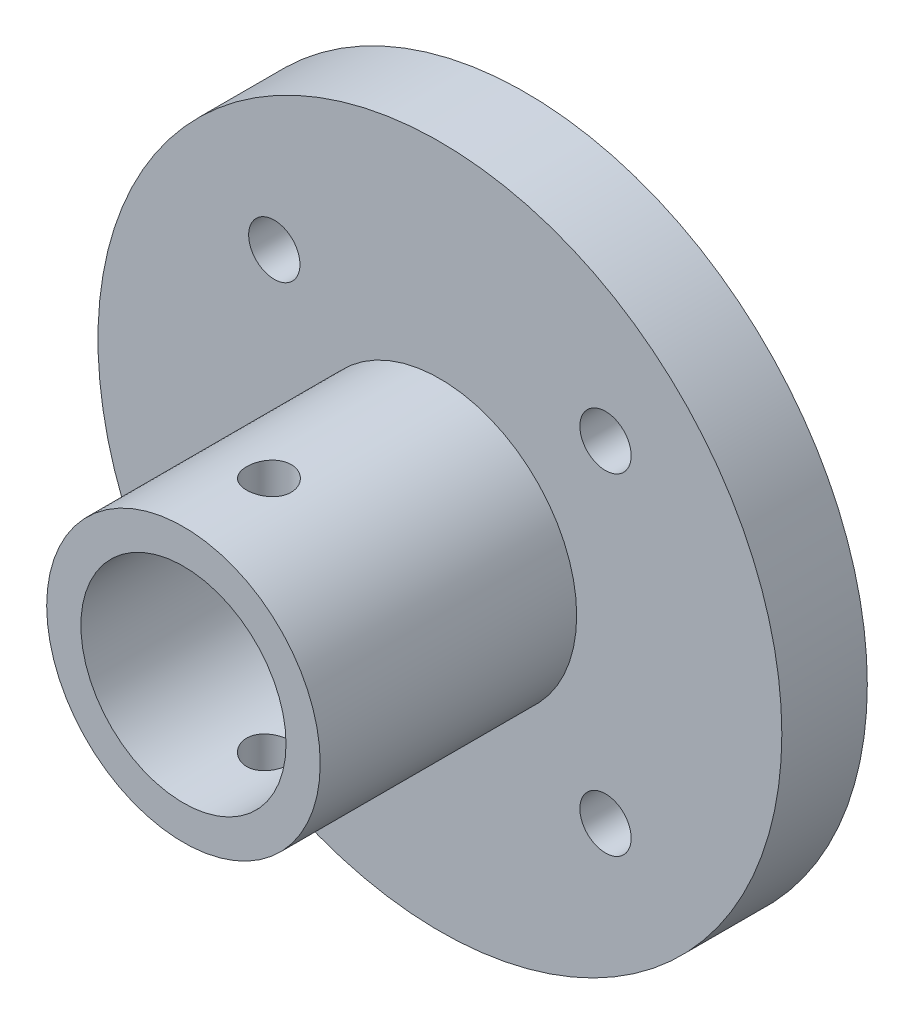
ISO-10303-21;
HEADER;
FILE_DESCRIPTION(('STEP AP214'),'2;1');
FILE_NAME('part.step','',(''),(''),'','','');
FILE_SCHEMA(('AUTOMOTIVE_DESIGN { 1 0 10303 214 1 1 1 1 }'));
ENDSEC;
DATA;
#1=APPLICATION_CONTEXT('core data for automotive mechanical design processes');
#2=APPLICATION_PROTOCOL_DEFINITION('international standard','automotive_design',2000,#1);
#3=PRODUCT_CONTEXT('',#1,'mechanical');
#4=PRODUCT('Part','Part','',(#3));
#5=PRODUCT_RELATED_PRODUCT_CATEGORY('part','',(#4));
#6=PRODUCT_DEFINITION_FORMATION('','',#4);
#7=PRODUCT_DEFINITION_CONTEXT('part definition',#1,'design');
#8=PRODUCT_DEFINITION('design','',#6,#7);
#9=PRODUCT_DEFINITION_SHAPE('','',#8);
#10=(LENGTH_UNIT() NAMED_UNIT(*) SI_UNIT(.MILLI.,.METRE.));
#11=(NAMED_UNIT(*) PLANE_ANGLE_UNIT() SI_UNIT($,.RADIAN.));
#12=(NAMED_UNIT(*) SI_UNIT($,.STERADIAN.) SOLID_ANGLE_UNIT());
#13=UNCERTAINTY_MEASURE_WITH_UNIT(LENGTH_MEASURE(1.E-05),#10,'distance_accuracy_value','');
#14=(GEOMETRIC_REPRESENTATION_CONTEXT(3) GLOBAL_UNCERTAINTY_ASSIGNED_CONTEXT((#13)) GLOBAL_UNIT_ASSIGNED_CONTEXT((#10,
#11,#12)) REPRESENTATION_CONTEXT('',''));
#15=CARTESIAN_POINT('',(0.,0.,0.));
#16=DIRECTION('',(0.,0.,1.));
#17=DIRECTION('',(1.,0.,0.));
#18=AXIS2_PLACEMENT_3D('',#15,#16,#17);
#19=CARTESIAN_POINT('',(0.,0.,5.));
#20=DIRECTION('',(0.,0.,1.));
#21=DIRECTION('',(1.,0.,0.));
#22=AXIS2_PLACEMENT_3D('',#19,#20,#21);
#23=PLANE('',#22);
#24=CARTESIAN_POINT('',(-9.68620346185681,-9.68620346185671,5.));
#25=DIRECTION('',(0.,0.,1.));
#26=DIRECTION('',(-1.,0.,0.));
#27=AXIS2_PLACEMENT_3D('',#24,#25,#26);
#28=CIRCLE('',#27,1.5);
#29=CARTESIAN_POINT('',(-11.1862034618568,-9.68620346185671,5.));
#30=VERTEX_POINT('',#29);
#31=EDGE_CURVE('E119',#30,#30,#28,.T.);
#32=ORIENTED_EDGE('',*,*,#31,.F.);
#33=EDGE_LOOP('',(#32));
#34=FACE_BOUND('',#33,.T.);
#35=CARTESIAN_POINT('',(9.68620346185681,9.68620346185671,5.));
#36=DIRECTION('',(0.,0.,1.));
#37=DIRECTION('',(-1.,0.,0.));
#38=AXIS2_PLACEMENT_3D('',#35,#36,#37);
#39=CIRCLE('',#38,1.5);
#40=CARTESIAN_POINT('',(8.18620346185681,9.68620346185671,5.));
#41=VERTEX_POINT('',#40);
#42=EDGE_CURVE('E133',#41,#41,#39,.T.);
#43=ORIENTED_EDGE('',*,*,#42,.F.);
#44=EDGE_LOOP('',(#43));
#45=FACE_BOUND('',#44,.T.);
#46=CARTESIAN_POINT('',(0.,0.,5.));
#47=DIRECTION('',(0.,0.,1.));
#48=DIRECTION('',(1.,0.,0.));
#49=AXIS2_PLACEMENT_3D('',#46,#47,#48);
#50=CIRCLE('',#49,20.);
#51=CARTESIAN_POINT('',(20.,0.,5.));
#52=VERTEX_POINT('',#51);
#53=EDGE_CURVE('E10',#52,#52,#50,.T.);
#54=ORIENTED_EDGE('',*,*,#53,.T.);
#55=EDGE_LOOP('',(#54));
#56=FACE_BOUND('',#55,.T.);
#57=CARTESIAN_POINT('',(-9.68620346185681,9.68620346185671,5.));
#58=DIRECTION('',(0.,0.,1.));
#59=DIRECTION('',(1.,0.,0.));
#60=AXIS2_PLACEMENT_3D('',#57,#58,#59);
#61=CIRCLE('',#60,1.5);
#62=CARTESIAN_POINT('',(-8.18620346185681,9.68620346185671,5.));
#63=VERTEX_POINT('',#62);
#64=EDGE_CURVE('E137',#63,#63,#61,.T.);
#65=ORIENTED_EDGE('',*,*,#64,.F.);
#66=EDGE_LOOP('',(#65));
#67=FACE_BOUND('',#66,.T.);
#68=CARTESIAN_POINT('',(9.68620346185681,-9.68620346185671,5.));
#69=DIRECTION('',(0.,0.,1.));
#70=DIRECTION('',(1.,0.,0.));
#71=AXIS2_PLACEMENT_3D('',#68,#69,#70);
#72=CIRCLE('',#71,1.5);
#73=CARTESIAN_POINT('',(11.1862034618568,-9.68620346185671,5.));
#74=VERTEX_POINT('',#73);
#75=EDGE_CURVE('E129',#74,#74,#72,.T.);
#76=ORIENTED_EDGE('',*,*,#75,.F.);
#77=EDGE_LOOP('',(#76));
#78=FACE_BOUND('',#77,.T.);
#79=CARTESIAN_POINT('',(0.,0.,5.));
#80=DIRECTION('',(0.,0.,1.));
#81=DIRECTION('',(1.,0.,0.));
#82=AXIS2_PLACEMENT_3D('',#79,#80,#81);
#83=CIRCLE('',#82,8.);
#84=CARTESIAN_POINT('',(8.,0.,5.));
#85=VERTEX_POINT('',#84);
#86=EDGE_CURVE('E125',#85,#85,#83,.T.);
#87=ORIENTED_EDGE('',*,*,#86,.F.);
#88=EDGE_LOOP('',(#87));
#89=FACE_BOUND('',#88,.T.);
#90=ADVANCED_FACE('F31',(#34,#45,#56,#67,#78,#89),#23,.T.);
#91=CARTESIAN_POINT('',(0.,0.,0.));
#92=DIRECTION('',(0.,0.,1.));
#93=DIRECTION('',(1.,0.,0.));
#94=AXIS2_PLACEMENT_3D('',#91,#92,#93);
#95=PLANE('',#94);
#96=CARTESIAN_POINT('',(0.,0.,0.));
#97=DIRECTION('',(0.,0.,1.));
#98=DIRECTION('',(1.,0.,0.));
#99=AXIS2_PLACEMENT_3D('',#96,#97,#98);
#100=CIRCLE('',#99,20.);
#101=CARTESIAN_POINT('',(20.,0.,0.));
#102=VERTEX_POINT('',#101);
#103=EDGE_CURVE('E43',#102,#102,#100,.T.);
#104=ORIENTED_EDGE('',*,*,#103,.F.);
#105=EDGE_LOOP('',(#104));
#106=FACE_BOUND('',#105,.T.);
#107=CARTESIAN_POINT('',(0.,0.,0.));
#108=DIRECTION('',(0.,0.,1.));
#109=DIRECTION('',(1.,0.,0.));
#110=AXIS2_PLACEMENT_3D('',#107,#108,#109);
#111=CIRCLE('',#110,6.);
#112=CARTESIAN_POINT('',(6.,0.,0.));
#113=VERTEX_POINT('',#112);
#114=EDGE_CURVE('E48',#113,#113,#111,.T.);
#115=ORIENTED_EDGE('',*,*,#114,.T.);
#116=EDGE_LOOP('',(#115));
#117=FACE_BOUND('',#116,.T.);
#118=CARTESIAN_POINT('',(-9.68620346185681,9.68620346185671,0.));
#119=DIRECTION('',(0.,0.,1.));
#120=DIRECTION('',(1.,0.,0.));
#121=AXIS2_PLACEMENT_3D('',#118,#119,#120);
#122=CIRCLE('',#121,1.5);
#123=CARTESIAN_POINT('',(-8.18620346185681,9.68620346185671,0.));
#124=VERTEX_POINT('',#123);
#125=EDGE_CURVE('E106',#124,#124,#122,.T.);
#126=ORIENTED_EDGE('',*,*,#125,.T.);
#127=EDGE_LOOP('',(#126));
#128=FACE_BOUND('',#127,.T.);
#129=CARTESIAN_POINT('',(9.68620346185681,9.68620346185671,0.));
#130=DIRECTION('',(0.,0.,1.));
#131=DIRECTION('',(-1.,0.,0.));
#132=AXIS2_PLACEMENT_3D('',#129,#130,#131);
#133=CIRCLE('',#132,1.5);
#134=CARTESIAN_POINT('',(8.18620346185681,9.68620346185671,0.));
#135=VERTEX_POINT('',#134);
#136=EDGE_CURVE('E110',#135,#135,#133,.T.);
#137=ORIENTED_EDGE('',*,*,#136,.T.);
#138=EDGE_LOOP('',(#137));
#139=FACE_BOUND('',#138,.T.);
#140=CARTESIAN_POINT('',(9.68620346185681,-9.68620346185671,0.));
#141=DIRECTION('',(0.,0.,1.));
#142=DIRECTION('',(1.,0.,0.));
#143=AXIS2_PLACEMENT_3D('',#140,#141,#142);
#144=CIRCLE('',#143,1.5);
#145=CARTESIAN_POINT('',(11.1862034618568,-9.68620346185671,0.));
#146=VERTEX_POINT('',#145);
#147=EDGE_CURVE('E114',#146,#146,#144,.T.);
#148=ORIENTED_EDGE('',*,*,#147,.T.);
#149=EDGE_LOOP('',(#148));
#150=FACE_BOUND('',#149,.T.);
#151=CARTESIAN_POINT('',(-9.68620346185681,-9.68620346185671,0.));
#152=DIRECTION('',(0.,0.,1.));
#153=DIRECTION('',(-1.,0.,0.));
#154=AXIS2_PLACEMENT_3D('',#151,#152,#153);
#155=CIRCLE('',#154,1.5);
#156=CARTESIAN_POINT('',(-11.1862034618568,-9.68620346185671,0.));
#157=VERTEX_POINT('',#156);
#158=EDGE_CURVE('E117',#157,#157,#155,.T.);
#159=ORIENTED_EDGE('',*,*,#158,.T.);
#160=EDGE_LOOP('',(#159));
#161=FACE_BOUND('',#160,.T.);
#162=ADVANCED_FACE('F90',(#106,#117,#128,#139,#150,#161),#95,.F.);
#163=CARTESIAN_POINT('',(0.,0.,5.));
#164=DIRECTION('',(0.,0.,-1.));
#165=DIRECTION('',(-1.,0.,0.));
#166=AXIS2_PLACEMENT_3D('',#163,#164,#165);
#167=CYLINDRICAL_SURFACE('',#166,20.);
#168=ORIENTED_EDGE('',*,*,#53,.F.);
#169=EDGE_LOOP('',(#168));
#170=FACE_BOUND('',#169,.T.);
#171=ORIENTED_EDGE('',*,*,#103,.T.);
#172=EDGE_LOOP('',(#171));
#173=FACE_BOUND('',#172,.T.);
#174=ADVANCED_FACE('F33',(#170,#173),#167,.T.);
#175=CARTESIAN_POINT('',(0.,0.,5.));
#176=DIRECTION('',(0.,0.,-1.));
#177=DIRECTION('',(-1.,0.,0.));
#178=AXIS2_PLACEMENT_3D('',#175,#176,#177);
#179=CYLINDRICAL_SURFACE('',#178,6.);
#180=CARTESIAN_POINT('',(0.,-6.,16.301925597688));
#181=CARTESIAN_POINT('',(0.0722225522556389,-5.9999986660787,16.3019231115351));
#182=CARTESIAN_POINT('',(0.14447527714328,-5.99868271184309,16.2958956351828));
#183=CARTESIAN_POINT('',(0.286929376806367,-5.99356019935167,16.2719694471695));
#184=CARTESIAN_POINT('',(0.357129231674901,-5.98975184221741,16.2540621611918));
#185=CARTESIAN_POINT('',(0.493398156167817,-5.9800686728557,16.2069628726351));
#186=CARTESIAN_POINT('',(0.559471424271425,-5.97419600261258,16.1777825641377));
#187=CARTESIAN_POINT('',(0.685781720002537,-5.96101847415905,16.1090024398041));
#188=CARTESIAN_POINT('',(0.746018917328764,-5.95371365761065,16.0694029270575));
#189=CARTESIAN_POINT('',(0.859901836073007,-5.93834332663798,15.9802459714752));
#190=CARTESIAN_POINT('',(0.913442096869974,-5.93026850222319,15.9305554137689));
#191=CARTESIAN_POINT('',(1.01149701474847,-5.91433404154723,15.8229127109291));
#192=CARTESIAN_POINT('',(1.05601087717529,-5.90647442428485,15.7649598391726));
#193=CARTESIAN_POINT('',(1.13521313338209,-5.89176856565059,15.6416598624638));
#194=CARTESIAN_POINT('',(1.16978955194762,-5.88493425876969,15.5762392793223));
#195=CARTESIAN_POINT('',(1.22741724526148,-5.87318632142876,15.4403435355366));
#196=CARTESIAN_POINT('',(1.25046987462628,-5.86827246523539,15.3698689700999));
#197=CARTESIAN_POINT('',(1.28404766607214,-5.86101655052557,15.2270088826443));
#198=CARTESIAN_POINT('',(1.29475938755671,-5.85863623530326,15.1546691939416));
#199=CARTESIAN_POINT('',(1.3039313203686,-5.85660198785184,15.0091833388932));
#200=CARTESIAN_POINT('',(1.30239301292097,-5.85694772599908,14.9360372711196));
#201=CARTESIAN_POINT('',(1.28725875480789,-5.86029187434003,14.7923997989849));
#202=CARTESIAN_POINT('',(1.27387924989609,-5.86324266429241,14.7218843125273));
#203=CARTESIAN_POINT('',(1.23578518581303,-5.87138917610019,14.584123275485));
#204=CARTESIAN_POINT('',(1.21106999974528,-5.87658502211286,14.5168779059749));
#205=CARTESIAN_POINT('',(1.15080664156936,-5.88868330086407,14.3869560018725));
#206=CARTESIAN_POINT('',(1.11517499653382,-5.89559880343725,14.3243194533073));
#207=CARTESIAN_POINT('',(1.03414888483502,-5.91034914046138,14.2058343298974));
#208=CARTESIAN_POINT('',(0.988753107351076,-5.91818409828363,14.1499866680281));
#209=CARTESIAN_POINT('',(0.888340334120309,-5.93409505416124,14.0454182102309));
#210=CARTESIAN_POINT('',(0.833139220797979,-5.9421726343636,13.9968742836473));
#211=CARTESIAN_POINT('',(0.715288483982947,-5.95750684216897,13.9097044279518));
#212=CARTESIAN_POINT('',(0.652638729709158,-5.96476345535331,13.871078673018));
#213=CARTESIAN_POINT('',(0.521455094954468,-5.97766107598465,13.8047989641655));
#214=CARTESIAN_POINT('',(0.452909295895972,-5.98329870601971,13.777167901007));
#215=CARTESIAN_POINT('',(0.31199820714713,-5.99229800205441,13.7338649316782));
#216=CARTESIAN_POINT('',(0.239633465466107,-5.99565999365071,13.7181913146045));
#217=CARTESIAN_POINT('',(0.0946560602199999,-5.99968295940403,13.6995047479866));
#218=CARTESIAN_POINT('',(0.0220759327056072,-6.00039547952921,13.6962501508006));
#219=CARTESIAN_POINT('',(-0.1225909353168,-5.99918354368445,13.7018394391357));
#220=CARTESIAN_POINT('',(-0.194677708409383,-5.99725926358977,13.7106825177386));
#221=CARTESIAN_POINT('',(-0.335512966169066,-5.99102244564979,13.7400157196482));
#222=CARTESIAN_POINT('',(-0.404289044979731,-5.98673585571554,13.760379363094));
#223=CARTESIAN_POINT('',(-0.53744939872132,-5.97625410103079,13.8120354681597));
#224=CARTESIAN_POINT('',(-0.601833303055578,-5.97005877547038,13.8433288506337));
#225=CARTESIAN_POINT('',(-0.725382820064091,-5.95631947784206,13.9164614664587));
#226=CARTESIAN_POINT('',(-0.784462182404095,-5.94875774287641,13.9584429993347));
#227=CARTESIAN_POINT('',(-0.894824228343959,-5.93316117425841,14.0515725287005));
#228=CARTESIAN_POINT('',(-0.946105914957435,-5.92512628029132,14.1027216955168));
#229=CARTESIAN_POINT('',(-1.04037010489555,-5.90931134685607,14.2138426074747));
#230=CARTESIAN_POINT('',(-1.08318541164402,-5.90153856229194,14.2739574084959));
#231=CARTESIAN_POINT('',(-1.15811310621895,-5.88729432979624,14.4006664178984));
#232=CARTESIAN_POINT('',(-1.19022595456335,-5.88082282587639,14.4672603473287));
#233=CARTESIAN_POINT('',(-1.24262207909274,-5.86997503693497,14.6046816389176));
#234=CARTESIAN_POINT('',(-1.26297145943996,-5.86558706898549,14.675482829229));
#235=CARTESIAN_POINT('',(-1.2914573808728,-5.8593817291553,14.819606933179));
#236=CARTESIAN_POINT('',(-1.29959583938032,-5.85756395369232,14.892929449056));
#237=CARTESIAN_POINT('',(-1.30334830095698,-5.85672995796827,15.0383297631023));
#238=CARTESIAN_POINT('',(-1.2992273098345,-5.85765445817055,15.1104005088571));
#239=CARTESIAN_POINT('',(-1.27916956445401,-5.86206693668976,15.2527944888059));
#240=CARTESIAN_POINT('',(-1.26323294488804,-5.86555488578469,15.323117742911));
#241=CARTESIAN_POINT('',(-1.2201234347199,-5.87467258765381,15.4598140487272));
#242=CARTESIAN_POINT('',(-1.19298852822042,-5.88029509498607,15.5261995946205));
#243=CARTESIAN_POINT('',(-1.12828555394478,-5.89305135537327,15.6535154910708));
#244=CARTESIAN_POINT('',(-1.09071641911818,-5.900185262973,15.714445282855));
#245=CARTESIAN_POINT('',(-1.00532994372966,-5.91533800804554,15.8304277547537));
#246=CARTESIAN_POINT('',(-0.957323496061684,-5.92337163365257,15.8853393083185));
#247=CARTESIAN_POINT('',(-0.852809065100796,-5.93931862229132,15.986414190123));
#248=CARTESIAN_POINT('',(-0.796299120778838,-5.94723195711757,16.0325754948658));
#249=CARTESIAN_POINT('',(-0.675515575803022,-5.96216609607497,16.1154010912594));
#250=CARTESIAN_POINT('',(-0.611152345919765,-5.96917426361034,16.1519370804659));
#251=CARTESIAN_POINT('',(-0.477060403678897,-5.98138191769254,16.213614456066));
#252=CARTESIAN_POINT('',(-0.40733628225979,-5.98658293123012,16.2387654678911));
#253=CARTESIAN_POINT('',(-0.281278210685381,-5.99365428599087,16.2724388415615));
#254=CARTESIAN_POINT('',(-0.225629859183479,-5.99601926835914,16.2834754124416));
#255=CARTESIAN_POINT('',(-0.113327169155402,-5.99919261526455,16.2982196083981));
#256=CARTESIAN_POINT('',(-0.0566728739851214,-6.00000104672504,16.3019275485666));
#257=CARTESIAN_POINT('',(0.,-6.,16.301925597688));
#258=B_SPLINE_CURVE_WITH_KNOTS('',3,(#180,#181,#182,#183,#184,#185,#186,#187,#188,#189,#190,
#191,#192,#193,#194,#195,#196,#197,#198,#199,#200,#201,#202,#203,#204,#205,#206,#207,#208,#209,
#210,#211,#212,#213,#214,#215,#216,#217,#218,#219,#220,#221,#222,#223,#224,#225,#226,#227,#228,
#229,#230,#231,#232,#233,#234,#235,#236,#237,#238,#239,#240,#241,#242,#243,#244,#245,#246,#247,
#248,#249,#250,#251,#252,#253,#254,#255,#256,#257),.UNSPECIFIED.,.T.,.F.,(4,2,2,2,2,2,2,2,2,2,2,
2,2,2,2,2,2,2,2,2,2,2,2,2,2,2,2,2,2,2,2,2,2,2,2,2,2,2,4),(0.,0.216460222852282,
0.433076847260712,0.649469364971901,0.865855588626085,1.08530707799076,1.30477787876966,
1.52663255294226,1.74846114205698,1.96689039556855,2.18529323787967,2.39978448666122,
2.61428759886981,2.83047367741662,3.04668879676693,3.26750314624514,3.48832137329063,
3.70959696433462,3.9308408887342,4.14775725239463,4.36465914838107,4.57922472775948,
4.79380838911249,5.01141378241322,5.22904697470536,5.45062320549926,5.67218990081975,
5.8924990978004,6.11277369707351,6.32832158316371,6.5438670121575,6.75868725245523,
6.97352946931691,7.19264816471728,7.41181746971381,7.63377525752516,7.85554503897787,
8.02540819137698,8.19526404040704),.UNSPECIFIED.);
#259=CARTESIAN_POINT('',(0.,-6.,16.301925597688));
#260=VERTEX_POINT('',#259);
#261=EDGE_CURVE('E76',#260,#260,#258,.T.);
#262=ORIENTED_EDGE('',*,*,#261,.F.);
#263=EDGE_LOOP('',(#262));
#264=FACE_BOUND('',#263,.T.);
#265=CARTESIAN_POINT('',(0.,6.,16.301925597688));
#266=CARTESIAN_POINT('',(-0.0722225522556355,5.9999986660787,16.3019231115351));
#267=CARTESIAN_POINT('',(-0.144475277143277,5.99868271184309,16.2958956351828));
#268=CARTESIAN_POINT('',(-0.286929376806364,5.99356019935167,16.2719694471695));
#269=CARTESIAN_POINT('',(-0.357129231674897,5.98975184221741,16.2540621611918));
#270=CARTESIAN_POINT('',(-0.493398156167814,5.9800686728557,16.2069628726351));
#271=CARTESIAN_POINT('',(-0.559471424271424,5.97419600261258,16.1777825641377));
#272=CARTESIAN_POINT('',(-0.685781720002535,5.96101847415906,16.1090024398041));
#273=CARTESIAN_POINT('',(-0.746018917328761,5.95371365761065,16.0694029270575));
#274=CARTESIAN_POINT('',(-0.859901836073004,5.93834332663798,15.9802459714752));
#275=CARTESIAN_POINT('',(-0.91344209686997,5.93026850222319,15.9305554137689));
#276=CARTESIAN_POINT('',(-1.01149701474846,5.91433404154723,15.8229127109291));
#277=CARTESIAN_POINT('',(-1.05601087717529,5.90647442428485,15.7649598391726));
#278=CARTESIAN_POINT('',(-1.13521313338208,5.89176856565059,15.6416598624638));
#279=CARTESIAN_POINT('',(-1.16978955194762,5.88493425876969,15.5762392793223));
#280=CARTESIAN_POINT('',(-1.22741724526148,5.87318632142876,15.4403435355366));
#281=CARTESIAN_POINT('',(-1.25046987462628,5.86827246523539,15.3698689700999));
#282=CARTESIAN_POINT('',(-1.28404766607214,5.86101655052557,15.2270088826443));
#283=CARTESIAN_POINT('',(-1.29475938755671,5.85863623530327,15.1546691939416));
#284=CARTESIAN_POINT('',(-1.3039313203686,5.85660198785184,15.0091833388932));
#285=CARTESIAN_POINT('',(-1.30239301292097,5.85694772599908,14.9360372711196));
#286=CARTESIAN_POINT('',(-1.28725875480788,5.86029187434003,14.7923997989849));
#287=CARTESIAN_POINT('',(-1.27387924989609,5.86324266429241,14.7218843125273));
#288=CARTESIAN_POINT('',(-1.23578518581303,5.87138917610019,14.584123275485));
#289=CARTESIAN_POINT('',(-1.21106999974528,5.87658502211286,14.5168779059749));
#290=CARTESIAN_POINT('',(-1.15080664156936,5.88868330086407,14.3869560018725));
#291=CARTESIAN_POINT('',(-1.11517499653382,5.89559880343725,14.3243194533073));
#292=CARTESIAN_POINT('',(-1.03414888483501,5.91034914046138,14.2058343298974));
#293=CARTESIAN_POINT('',(-0.988753107351073,5.91818409828363,14.1499866680281));
#294=CARTESIAN_POINT('',(-0.888340334120305,5.93409505416124,14.0454182102309));
#295=CARTESIAN_POINT('',(-0.833139220797976,5.9421726343636,13.9968742836473));
#296=CARTESIAN_POINT('',(-0.715288483982944,5.95750684216897,13.9097044279518));
#297=CARTESIAN_POINT('',(-0.652638729709155,5.96476345535331,13.871078673018));
#298=CARTESIAN_POINT('',(-0.521455094954464,5.97766107598465,13.8047989641655));
#299=CARTESIAN_POINT('',(-0.452909295895969,5.98329870601972,13.777167901007));
#300=CARTESIAN_POINT('',(-0.311998207147126,5.99229800205441,13.7338649316782));
#301=CARTESIAN_POINT('',(-0.239633465466103,5.99565999365071,13.7181913146045));
#302=CARTESIAN_POINT('',(-0.0946560602199962,5.99968295940403,13.6995047479866));
#303=CARTESIAN_POINT('',(-0.0220759327056035,6.00039547952921,13.6962501508006));
#304=CARTESIAN_POINT('',(0.122590935316804,5.99918354368445,13.7018394391357));
#305=CARTESIAN_POINT('',(0.194677708409387,5.99725926358977,13.7106825177386));
#306=CARTESIAN_POINT('',(0.335512966169069,5.99102244564979,13.7400157196482));
#307=CARTESIAN_POINT('',(0.404289044979735,5.98673585571554,13.760379363094));
#308=CARTESIAN_POINT('',(0.537449398721323,5.97625410103079,13.8120354681597));
#309=CARTESIAN_POINT('',(0.601833303055581,5.97005877547038,13.8433288506337));
#310=CARTESIAN_POINT('',(0.725382820064095,5.95631947784206,13.9164614664587));
#311=CARTESIAN_POINT('',(0.784462182404099,5.94875774287641,13.9584429993347));
#312=CARTESIAN_POINT('',(0.894824228343963,5.93316117425841,14.0515725287005));
#313=CARTESIAN_POINT('',(0.946105914957439,5.92512628029132,14.1027216955168));
#314=CARTESIAN_POINT('',(1.04037010489555,5.90931134685607,14.2138426074747));
#315=CARTESIAN_POINT('',(1.08318541164403,5.90153856229194,14.2739574084959));
#316=CARTESIAN_POINT('',(1.15811310621896,5.88729432979624,14.4006664178984));
#317=CARTESIAN_POINT('',(1.19022595456335,5.88082282587639,14.4672603473287));
#318=CARTESIAN_POINT('',(1.24262207909275,5.86997503693497,14.6046816389176));
#319=CARTESIAN_POINT('',(1.26297145943996,5.86558706898548,14.675482829229));
#320=CARTESIAN_POINT('',(1.2914573808728,5.8593817291553,14.819606933179));
#321=CARTESIAN_POINT('',(1.29959583938033,5.85756395369232,14.892929449056));
#322=CARTESIAN_POINT('',(1.30334830095698,5.85672995796827,15.0383297631023));
#323=CARTESIAN_POINT('',(1.29922730983451,5.85765445817055,15.1104005088571));
#324=CARTESIAN_POINT('',(1.27916956445402,5.86206693668976,15.2527944888059));
#325=CARTESIAN_POINT('',(1.26323294488805,5.86555488578469,15.323117742911));
#326=CARTESIAN_POINT('',(1.2201234347199,5.87467258765381,15.4598140487272));
#327=CARTESIAN_POINT('',(1.19298852822043,5.88029509498607,15.5261995946205));
#328=CARTESIAN_POINT('',(1.12828555394478,5.89305135537327,15.6535154910708));
#329=CARTESIAN_POINT('',(1.09071641911818,5.900185262973,15.714445282855));
#330=CARTESIAN_POINT('',(1.00532994372966,5.91533800804554,15.8304277547537));
#331=CARTESIAN_POINT('',(0.957323496061688,5.92337163365257,15.8853393083185));
#332=CARTESIAN_POINT('',(0.852809065100799,5.93931862229132,15.986414190123));
#333=CARTESIAN_POINT('',(0.796299120778842,5.94723195711757,16.0325754948658));
#334=CARTESIAN_POINT('',(0.675515575803026,5.96216609607497,16.1154010912594));
#335=CARTESIAN_POINT('',(0.611152345919769,5.96917426361034,16.1519370804659));
#336=CARTESIAN_POINT('',(0.4770604036789,5.98138191769254,16.213614456066));
#337=CARTESIAN_POINT('',(0.407336282259793,5.98658293123012,16.2387654678911));
#338=CARTESIAN_POINT('',(0.281278210685385,5.99365428599087,16.2724388415615));
#339=CARTESIAN_POINT('',(0.225629859183483,5.99601926835914,16.2834754124416));
#340=CARTESIAN_POINT('',(0.113327169155406,5.99919261526455,16.2982196083981));
#341=CARTESIAN_POINT('',(0.0566728739851249,6.00000104672504,16.3019275485666));
#342=CARTESIAN_POINT('',(0.,6.,16.301925597688));
#343=B_SPLINE_CURVE_WITH_KNOTS('',3,(#265,#266,#267,#268,#269,#270,#271,#272,#273,#274,#275,
#276,#277,#278,#279,#280,#281,#282,#283,#284,#285,#286,#287,#288,#289,#290,#291,#292,#293,#294,
#295,#296,#297,#298,#299,#300,#301,#302,#303,#304,#305,#306,#307,#308,#309,#310,#311,#312,#313,
#314,#315,#316,#317,#318,#319,#320,#321,#322,#323,#324,#325,#326,#327,#328,#329,#330,#331,#332,
#333,#334,#335,#336,#337,#338,#339,#340,#341,#342),.UNSPECIFIED.,.T.,.F.,(4,2,2,2,2,2,2,2,2,2,2,
2,2,2,2,2,2,2,2,2,2,2,2,2,2,2,2,2,2,2,2,2,2,2,2,2,2,2,4),(0.,0.216460222852282,
0.433076847260712,0.649469364971903,0.865855588626085,1.08530707799076,1.30477787876966,
1.52663255294226,1.74846114205698,1.96689039556855,2.18529323787967,2.39978448666122,
2.61428759886981,2.83047367741662,3.04668879676693,3.26750314624514,3.48832137329063,
3.70959696433462,3.9308408887342,4.14775725239463,4.36465914838107,4.57922472775948,
4.79380838911249,5.01141378241322,5.22904697470536,5.45062320549926,5.67218990081975,
5.8924990978004,6.11277369707351,6.32832158316371,6.5438670121575,6.75868725245524,
6.97352946931691,7.19264816471728,7.41181746971381,7.63377525752516,7.85554503897787,
8.02540819137698,8.19526404040704),.UNSPECIFIED.);
#344=CARTESIAN_POINT('',(0.,6.,16.301925597688));
#345=VERTEX_POINT('',#344);
#346=EDGE_CURVE('E71',#345,#345,#343,.T.);
#347=ORIENTED_EDGE('',*,*,#346,.F.);
#348=EDGE_LOOP('',(#347));
#349=FACE_BOUND('',#348,.T.);
#350=ORIENTED_EDGE('',*,*,#114,.F.);
#351=EDGE_LOOP('',(#350));
#352=FACE_BOUND('',#351,.T.);
#353=CARTESIAN_POINT('',(0.,0.,20.));
#354=DIRECTION('',(0.,0.,1.));
#355=DIRECTION('',(1.,0.,0.));
#356=AXIS2_PLACEMENT_3D('',#353,#354,#355);
#357=CIRCLE('',#356,6.);
#358=CARTESIAN_POINT('',(6.,0.,20.));
#359=VERTEX_POINT('',#358);
#360=EDGE_CURVE('E149',#359,#359,#357,.T.);
#361=ORIENTED_EDGE('',*,*,#360,.T.);
#362=EDGE_LOOP('',(#361));
#363=FACE_BOUND('',#362,.T.);
#364=ADVANCED_FACE('F80',(#264,#349,#352,#363),#179,.F.);
#365=CARTESIAN_POINT('',(-9.68620346185681,9.68620346185671,5.));
#366=DIRECTION('',(0.,0.,-1.));
#367=DIRECTION('',(-1.,0.,0.));
#368=AXIS2_PLACEMENT_3D('',#365,#366,#367);
#369=CYLINDRICAL_SURFACE('',#368,1.5);
#370=ORIENTED_EDGE('',*,*,#64,.T.);
#371=EDGE_LOOP('',(#370));
#372=FACE_BOUND('',#371,.T.);
#373=ORIENTED_EDGE('',*,*,#125,.F.);
#374=EDGE_LOOP('',(#373));
#375=FACE_BOUND('',#374,.T.);
#376=ADVANCED_FACE('F85',(#372,#375),#369,.F.);
#377=CARTESIAN_POINT('',(9.68620346185681,9.68620346185671,5.));
#378=DIRECTION('',(0.,0.,-1.));
#379=DIRECTION('',(-1.,0.,0.));
#380=AXIS2_PLACEMENT_3D('',#377,#378,#379);
#381=CYLINDRICAL_SURFACE('',#380,1.5);
#382=ORIENTED_EDGE('',*,*,#42,.T.);
#383=EDGE_LOOP('',(#382));
#384=FACE_BOUND('',#383,.T.);
#385=ORIENTED_EDGE('',*,*,#136,.F.);
#386=EDGE_LOOP('',(#385));
#387=FACE_BOUND('',#386,.T.);
#388=ADVANCED_FACE('F180',(#384,#387),#381,.F.);
#389=CARTESIAN_POINT('',(9.68620346185681,-9.68620346185671,5.));
#390=DIRECTION('',(0.,0.,-1.));
#391=DIRECTION('',(-1.,0.,0.));
#392=AXIS2_PLACEMENT_3D('',#389,#390,#391);
#393=CYLINDRICAL_SURFACE('',#392,1.5);
#394=ORIENTED_EDGE('',*,*,#75,.T.);
#395=EDGE_LOOP('',(#394));
#396=FACE_BOUND('',#395,.T.);
#397=ORIENTED_EDGE('',*,*,#147,.F.);
#398=EDGE_LOOP('',(#397));
#399=FACE_BOUND('',#398,.T.);
#400=ADVANCED_FACE('F175',(#396,#399),#393,.F.);
#401=CARTESIAN_POINT('',(-9.68620346185681,-9.68620346185671,5.));
#402=DIRECTION('',(0.,0.,-1.));
#403=DIRECTION('',(-1.,0.,0.));
#404=AXIS2_PLACEMENT_3D('',#401,#402,#403);
#405=CYLINDRICAL_SURFACE('',#404,1.5);
#406=ORIENTED_EDGE('',*,*,#31,.T.);
#407=EDGE_LOOP('',(#406));
#408=FACE_BOUND('',#407,.T.);
#409=ORIENTED_EDGE('',*,*,#158,.F.);
#410=EDGE_LOOP('',(#409));
#411=FACE_BOUND('',#410,.T.);
#412=ADVANCED_FACE('F171',(#408,#411),#405,.F.);
#413=CARTESIAN_POINT('',(0.,0.,20.));
#414=DIRECTION('',(0.,0.,1.));
#415=DIRECTION('',(1.,0.,0.));
#416=AXIS2_PLACEMENT_3D('',#413,#414,#415);
#417=PLANE('',#416);
#418=CARTESIAN_POINT('',(0.,0.,20.));
#419=DIRECTION('',(0.,0.,1.));
#420=DIRECTION('',(1.,0.,0.));
#421=AXIS2_PLACEMENT_3D('',#418,#419,#420);
#422=CIRCLE('',#421,8.);
#423=CARTESIAN_POINT('',(8.,0.,20.));
#424=VERTEX_POINT('',#423);
#425=EDGE_CURVE('E120',#424,#424,#422,.T.);
#426=ORIENTED_EDGE('',*,*,#425,.T.);
#427=EDGE_LOOP('',(#426));
#428=FACE_BOUND('',#427,.T.);
#429=ORIENTED_EDGE('',*,*,#360,.F.);
#430=EDGE_LOOP('',(#429));
#431=FACE_BOUND('',#430,.T.);
#432=ADVANCED_FACE('F65',(#428,#431),#417,.T.);
#433=CARTESIAN_POINT('',(0.,0.,20.));
#434=DIRECTION('',(0.,0.,-1.));
#435=DIRECTION('',(-1.,0.,0.));
#436=AXIS2_PLACEMENT_3D('',#433,#434,#435);
#437=CYLINDRICAL_SURFACE('',#436,8.);
#438=CARTESIAN_POINT('',(0.,-8.,16.301925597688));
#439=CARTESIAN_POINT('',(0.0726154812771378,-7.99999877304601,16.3019226646682));
#440=CARTESIAN_POINT('',(0.145271207285782,-7.99900099705732,16.2958298367484));
#441=CARTESIAN_POINT('',(0.288546587968042,-7.9951167387072,16.2716286696691));
#442=CARTESIAN_POINT('',(0.359164279181477,-7.99222849456504,16.253509122248));
#443=CARTESIAN_POINT('',(0.496269815828486,-7.98488740630411,16.2058146796236));
#444=CARTESIAN_POINT('',(0.562760927370698,-7.98043581861546,16.1762489815307));
#445=CARTESIAN_POINT('',(0.689829628350651,-7.97045810299482,16.1065251963364));
#446=CARTESIAN_POINT('',(0.750407928186082,-7.96493210438774,16.0663683838611));
#447=CARTESIAN_POINT('',(0.864493581179434,-7.95336219547985,15.9762119713338));
#448=CARTESIAN_POINT('',(0.917939096426416,-7.94731442138239,15.9261346079341));
#449=CARTESIAN_POINT('',(1.01570805116992,-7.93541231911579,15.8177259817644));
#450=CARTESIAN_POINT('',(1.06003092773492,-7.92955800290307,15.7593942100135));
#451=CARTESIAN_POINT('',(1.13854254621549,-7.91866823227222,15.6357100520794));
#452=CARTESIAN_POINT('',(1.17267045839357,-7.91363777089482,15.5703185747771));
#453=CARTESIAN_POINT('',(1.22943444950572,-7.90501868337939,15.434635682502));
#454=CARTESIAN_POINT('',(1.25207126766794,-7.9014299644964,15.3643445830555));
#455=CARTESIAN_POINT('',(1.28501633285046,-7.89613904085071,15.2215120324336));
#456=CARTESIAN_POINT('',(1.29543112714903,-7.89442054188908,15.1489957718374));
#457=CARTESIAN_POINT('',(1.30396678982124,-7.89301530069185,15.0032261615564));
#458=CARTESIAN_POINT('',(1.30208848786081,-7.89332842134145,14.9299728619479));
#459=CARTESIAN_POINT('',(1.28617813197762,-7.89593615803214,14.7855672091446));
#460=CARTESIAN_POINT('',(1.27226551725269,-7.89821130055724,14.7144012936374));
#461=CARTESIAN_POINT('',(1.23286878980259,-7.90445626261759,14.5754274936882));
#462=CARTESIAN_POINT('',(1.2073842971055,-7.9084261378005,14.5076197195946));
#463=CARTESIAN_POINT('',(1.14544536719715,-7.91763441261594,14.3769280262487));
#464=CARTESIAN_POINT('',(1.10894108996224,-7.92287855399417,14.314068148929));
#465=CARTESIAN_POINT('',(1.02603422562257,-7.93404045331915,14.1953207516772));
#466=CARTESIAN_POINT('',(0.979630876030744,-7.93995826313956,14.139433769366));
#467=CARTESIAN_POINT('',(0.877591135270602,-7.95188639438553,14.035527007197));
#468=CARTESIAN_POINT('',(0.821852214296534,-7.95789698321382,13.987607888448));
#469=CARTESIAN_POINT('',(0.703070971278662,-7.96926878097484,13.901787855478));
#470=CARTESIAN_POINT('',(0.640028606154202,-7.9746299860767,13.8638870003558));
#471=CARTESIAN_POINT('',(0.508337179959086,-7.98410605459026,13.7991711793847));
#472=CARTESIAN_POINT('',(0.439683810412971,-7.98821994860497,13.7723648301924));
#473=CARTESIAN_POINT('',(0.298767594086919,-7.99473001455149,13.7306909231307));
#474=CARTESIAN_POINT('',(0.226505035523192,-7.99712632340932,13.7158224135643));
#475=CARTESIAN_POINT('',(0.0812896003079446,-7.99991287589468,13.6985820684029));
#476=CARTESIAN_POINT('',(0.00835354610211747,-8.00032530906246,13.6960719968398));
#477=CARTESIAN_POINT('',(-0.136897192531536,-7.99915832419853,13.7032516337039));
#478=CARTESIAN_POINT('',(-0.209211899620205,-7.99757897912108,13.7129408952975));
#479=CARTESIAN_POINT('',(-0.350742232068427,-7.99261962799478,13.7441291834347));
#480=CARTESIAN_POINT('',(-0.419973275789506,-7.98925001957977,13.7655600384291));
#481=CARTESIAN_POINT('',(-0.553859793706442,-7.98108651895957,13.8195506886438));
#482=CARTESIAN_POINT('',(-0.618515020752015,-7.976292549894,13.852111084443));
#483=CARTESIAN_POINT('',(-0.742016846147357,-7.96575729934662,13.9277550321985));
#484=CARTESIAN_POINT('',(-0.800809688220899,-7.96000834824488,13.9709252620295));
#485=CARTESIAN_POINT('',(-0.910365649587973,-7.94822470782197,14.0664438478051));
#486=CARTESIAN_POINT('',(-0.961128213955851,-7.94218999879113,14.1187928375137));
#487=CARTESIAN_POINT('',(-1.05369277245768,-7.93044357969678,14.231801832954));
#488=CARTESIAN_POINT('',(-1.09540154387389,-7.92473563827234,14.2925386494659));
#489=CARTESIAN_POINT('',(-1.16802424871126,-7.91435851785286,14.4202376989663));
#490=CARTESIAN_POINT('',(-1.19893851255175,-7.90968930706392,14.4871997413215));
#491=CARTESIAN_POINT('',(-1.24895399171133,-7.90194635348704,14.6251835474994));
#492=CARTESIAN_POINT('',(-1.26810225691113,-7.89886626415468,14.6961878848473));
#493=CARTESIAN_POINT('',(-1.29419068174635,-7.89463413662949,14.8404591780437));
#494=CARTESIAN_POINT('',(-1.30113184865768,-7.89348193935589,14.9137259466987));
#495=CARTESIAN_POINT('',(-1.30258195642585,-7.89324268727788,15.059511871946));
#496=CARTESIAN_POINT('',(-1.29723759198183,-7.89413126460241,15.1320295713685));
#497=CARTESIAN_POINT('',(-1.27458485049378,-7.89782014537259,15.275119507032));
#498=CARTESIAN_POINT('',(-1.25727650712385,-7.90062044343745,15.3456917487482));
#499=CARTESIAN_POINT('',(-1.21124228329201,-7.9078081625656,15.4828346742169));
#500=CARTESIAN_POINT('',(-1.18252845442488,-7.9121939079292,15.5494094966341));
#501=CARTESIAN_POINT('',(-1.11451328055342,-7.92206007747459,15.6768206267516));
#502=CARTESIAN_POINT('',(-1.07521145070565,-7.92754055178301,15.7376566714908));
#503=CARTESIAN_POINT('',(-0.986610045021606,-7.93905619253421,15.8526055189493));
#504=CARTESIAN_POINT('',(-0.937202362631372,-7.94509693431205,15.9066344470846));
#505=CARTESIAN_POINT('',(-0.830019925104729,-7.95700749821389,16.0056852002167));
#506=CARTESIAN_POINT('',(-0.772243238843318,-7.96287728051297,16.0507049406421));
#507=CARTESIAN_POINT('',(-0.649513708313684,-7.97382900721807,16.1307277255507));
#508=CARTESIAN_POINT('',(-0.584516308252591,-7.97890553531871,16.1656631784512));
#509=CARTESIAN_POINT('',(-0.449520575109127,-7.98764599475312,16.2240666782912));
#510=CARTESIAN_POINT('',(-0.379527353219571,-7.991311345977,16.2475462582305));
#511=CARTESIAN_POINT('',(-0.257709638745891,-7.99600755006165,16.2772186022716));
#512=CARTESIAN_POINT('',(-0.206625918931347,-7.99749679348154,16.2864690549016));
#513=CARTESIAN_POINT('',(-0.103701633810479,-7.99949344875137,16.298823550912));
#514=CARTESIAN_POINT('',(-0.051861080599859,-8.0000008762754,16.3019276924146));
#515=CARTESIAN_POINT('',(0.,-8.,16.301925597688));
#516=B_SPLINE_CURVE_WITH_KNOTS('',3,(#438,#439,#440,#441,#442,#443,#444,#445,#446,#447,#448,
#449,#450,#451,#452,#453,#454,#455,#456,#457,#458,#459,#460,#461,#462,#463,#464,#465,#466,#467,
#468,#469,#470,#471,#472,#473,#474,#475,#476,#477,#478,#479,#480,#481,#482,#483,#484,#485,#486,
#487,#488,#489,#490,#491,#492,#493,#494,#495,#496,#497,#498,#499,#500,#501,#502,#503,#504,#505,
#506,#507,#508,#509,#510,#511,#512,#513,#514,#515),.UNSPECIFIED.,.T.,.F.,(4,2,2,2,2,2,2,2,2,2,2,
2,2,2,2,2,2,2,2,2,2,2,2,2,2,2,2,2,2,2,2,2,2,2,2,2,2,2,4),(0.,0.217656891727491,
0.435516913422752,0.653202244255275,0.870861388899118,1.09029947681952,1.30975110156962,
1.53048709946223,1.75120889549157,1.96999187615193,2.18876009121478,2.40538164937493,
2.6220103209928,2.83963382040476,3.05727408856564,3.27748361156862,3.49769443358255,
3.71807596498952,3.93843992561021,4.15633330384745,4.37421870138202,4.59085226222413,
4.80749751502261,5.02597520372512,5.24446798355739,5.46511370672391,5.68575267534383,
5.90550351123592,6.12523621340734,6.34235885843438,6.55948089234521,6.7763741121876,
6.99327726564553,7.21263500788995,7.43204344721068,7.6528900619265,7.87351388205053,
8.02896422976871,8.18441209579489),.UNSPECIFIED.);
#517=CARTESIAN_POINT('',(0.,-8.,16.301925597688));
#518=VERTEX_POINT('',#517);
#519=EDGE_CURVE('E35',#518,#518,#516,.T.);
#520=ORIENTED_EDGE('',*,*,#519,.T.);
#521=EDGE_LOOP('',(#520));
#522=FACE_BOUND('',#521,.T.);
#523=CARTESIAN_POINT('',(0.,8.,16.301925597688));
#524=CARTESIAN_POINT('',(-0.0726154812771344,7.99999877304601,16.3019226646682));
#525=CARTESIAN_POINT('',(-0.145271207285778,7.99900099705732,16.2958298367484));
#526=CARTESIAN_POINT('',(-0.288546587968038,7.9951167387072,16.2716286696691));
#527=CARTESIAN_POINT('',(-0.359164279181474,7.99222849456504,16.253509122248));
#528=CARTESIAN_POINT('',(-0.496269815828483,7.98488740630411,16.2058146796236));
#529=CARTESIAN_POINT('',(-0.562760927370695,7.98043581861546,16.1762489815307));
#530=CARTESIAN_POINT('',(-0.689829628350648,7.97045810299482,16.1065251963364));
#531=CARTESIAN_POINT('',(-0.750407928186079,7.96493210438774,16.0663683838611));
#532=CARTESIAN_POINT('',(-0.86449358117943,7.95336219547985,15.9762119713338));
#533=CARTESIAN_POINT('',(-0.917939096426412,7.94731442138239,15.9261346079341));
#534=CARTESIAN_POINT('',(-1.01570805116992,7.93541231911579,15.8177259817644));
#535=CARTESIAN_POINT('',(-1.06003092773492,7.92955800290307,15.7593942100135));
#536=CARTESIAN_POINT('',(-1.13854254621549,7.91866823227222,15.6357100520794));
#537=CARTESIAN_POINT('',(-1.17267045839356,7.91363777089482,15.5703185747771));
#538=CARTESIAN_POINT('',(-1.22943444950572,7.90501868337939,15.434635682502));
#539=CARTESIAN_POINT('',(-1.25207126766793,7.9014299644964,15.3643445830555));
#540=CARTESIAN_POINT('',(-1.28501633285045,7.89613904085071,15.2215120324336));
#541=CARTESIAN_POINT('',(-1.29543112714903,7.89442054188908,15.1489957718374));
#542=CARTESIAN_POINT('',(-1.30396678982124,7.89301530069186,15.0032261615564));
#543=CARTESIAN_POINT('',(-1.3020884878608,7.89332842134145,14.9299728619479));
#544=CARTESIAN_POINT('',(-1.28617813197762,7.89593615803214,14.7855672091446));
#545=CARTESIAN_POINT('',(-1.27226551725269,7.89821130055724,14.7144012936374));
#546=CARTESIAN_POINT('',(-1.23286878980259,7.90445626261759,14.5754274936882));
#547=CARTESIAN_POINT('',(-1.20738429710549,7.9084261378005,14.5076197195946));
#548=CARTESIAN_POINT('',(-1.14544536719715,7.91763441261594,14.3769280262487));
#549=CARTESIAN_POINT('',(-1.10894108996224,7.92287855399417,14.314068148929));
#550=CARTESIAN_POINT('',(-1.02603422562257,7.93404045331915,14.1953207516772));
#551=CARTESIAN_POINT('',(-0.97963087603074,7.93995826313956,14.139433769366));
#552=CARTESIAN_POINT('',(-0.877591135270599,7.95188639438554,14.035527007197));
#553=CARTESIAN_POINT('',(-0.821852214296531,7.95789698321382,13.987607888448));
#554=CARTESIAN_POINT('',(-0.703070971278659,7.96926878097484,13.901787855478));
#555=CARTESIAN_POINT('',(-0.640028606154198,7.9746299860767,13.8638870003558));
#556=CARTESIAN_POINT('',(-0.508337179959082,7.98410605459026,13.7991711793847));
#557=CARTESIAN_POINT('',(-0.439683810412967,7.98821994860497,13.7723648301924));
#558=CARTESIAN_POINT('',(-0.298767594086915,7.99473001455149,13.7306909231307));
#559=CARTESIAN_POINT('',(-0.226505035523188,7.99712632340932,13.7158224135643));
#560=CARTESIAN_POINT('',(-0.0812896003079406,7.99991287589468,13.6985820684029));
#561=CARTESIAN_POINT('',(-0.00835354610211335,8.00032530906246,13.6960719968398));
#562=CARTESIAN_POINT('',(0.13689719253154,7.99915832419853,13.7032516337039));
#563=CARTESIAN_POINT('',(0.209211899620209,7.99757897912108,13.7129408952975));
#564=CARTESIAN_POINT('',(0.350742232068431,7.99261962799477,13.7441291834347));
#565=CARTESIAN_POINT('',(0.41997327578951,7.98925001957977,13.7655600384291));
#566=CARTESIAN_POINT('',(0.553859793706446,7.98108651895957,13.8195506886438));
#567=CARTESIAN_POINT('',(0.618515020752019,7.976292549894,13.852111084443));
#568=CARTESIAN_POINT('',(0.742016846147361,7.96575729934662,13.9277550321985));
#569=CARTESIAN_POINT('',(0.800809688220902,7.96000834824488,13.9709252620295));
#570=CARTESIAN_POINT('',(0.910365649587977,7.94822470782197,14.0664438478051));
#571=CARTESIAN_POINT('',(0.961128213955855,7.94218999879113,14.1187928375137));
#572=CARTESIAN_POINT('',(1.05369277245768,7.93044357969678,14.231801832954));
#573=CARTESIAN_POINT('',(1.09540154387389,7.92473563827234,14.2925386494659));
#574=CARTESIAN_POINT('',(1.16802424871126,7.91435851785286,14.4202376989663));
#575=CARTESIAN_POINT('',(1.19893851255176,7.90968930706392,14.4871997413215));
#576=CARTESIAN_POINT('',(1.24895399171133,7.90194635348704,14.6251835474994));
#577=CARTESIAN_POINT('',(1.26810225691113,7.89886626415468,14.6961878848473));
#578=CARTESIAN_POINT('',(1.29419068174635,7.89463413662949,14.8404591780437));
#579=CARTESIAN_POINT('',(1.30113184865768,7.89348193935589,14.9137259466987));
#580=CARTESIAN_POINT('',(1.30258195642585,7.89324268727788,15.059511871946));
#581=CARTESIAN_POINT('',(1.29723759198183,7.89413126460241,15.1320295713685));
#582=CARTESIAN_POINT('',(1.27458485049378,7.89782014537259,15.275119507032));
#583=CARTESIAN_POINT('',(1.25727650712385,7.90062044343745,15.3456917487482));
#584=CARTESIAN_POINT('',(1.21124228329201,7.9078081625656,15.4828346742169));
#585=CARTESIAN_POINT('',(1.18252845442489,7.9121939079292,15.5494094966341));
#586=CARTESIAN_POINT('',(1.11451328055342,7.92206007747459,15.6768206267516));
#587=CARTESIAN_POINT('',(1.07521145070565,7.92754055178301,15.7376566714908));
#588=CARTESIAN_POINT('',(0.986610045021609,7.93905619253421,15.8526055189493));
#589=CARTESIAN_POINT('',(0.937202362631376,7.94509693431205,15.9066344470846));
#590=CARTESIAN_POINT('',(0.830019925104733,7.95700749821389,16.0056852002167));
#591=CARTESIAN_POINT('',(0.772243238843321,7.96287728051297,16.0507049406421));
#592=CARTESIAN_POINT('',(0.649513708313687,7.97382900721807,16.1307277255507));
#593=CARTESIAN_POINT('',(0.584516308252594,7.97890553531871,16.1656631784512));
#594=CARTESIAN_POINT('',(0.44952057510913,7.98764599475312,16.2240666782912));
#595=CARTESIAN_POINT('',(0.379527353219574,7.991311345977,16.2475462582305));
#596=CARTESIAN_POINT('',(0.257709638745895,7.99600755006165,16.2772186022716));
#597=CARTESIAN_POINT('',(0.20662591893135,7.99749679348154,16.2864690549016));
#598=CARTESIAN_POINT('',(0.103701633810482,7.99949344875137,16.298823550912));
#599=CARTESIAN_POINT('',(0.0518610805998625,8.0000008762754,16.3019276924146));
#600=CARTESIAN_POINT('',(0.,8.,16.301925597688));
#601=B_SPLINE_CURVE_WITH_KNOTS('',3,(#523,#524,#525,#526,#527,#528,#529,#530,#531,#532,#533,
#534,#535,#536,#537,#538,#539,#540,#541,#542,#543,#544,#545,#546,#547,#548,#549,#550,#551,#552,
#553,#554,#555,#556,#557,#558,#559,#560,#561,#562,#563,#564,#565,#566,#567,#568,#569,#570,#571,
#572,#573,#574,#575,#576,#577,#578,#579,#580,#581,#582,#583,#584,#585,#586,#587,#588,#589,#590,
#591,#592,#593,#594,#595,#596,#597,#598,#599,#600),.UNSPECIFIED.,.T.,.F.,(4,2,2,2,2,2,2,2,2,2,2,
2,2,2,2,2,2,2,2,2,2,2,2,2,2,2,2,2,2,2,2,2,2,2,2,2,2,2,4),(0.,0.217656891727491,
0.435516913422752,0.653202244255275,0.870861388899118,1.09029947681952,1.30975110156962,
1.53048709946223,1.75120889549157,1.96999187615194,2.18876009121478,2.40538164937493,
2.6220103209928,2.83963382040476,3.05727408856564,3.27748361156862,3.49769443358255,
3.71807596498952,3.93843992561021,4.15633330384745,4.37421870138202,4.59085226222413,
4.80749751502261,5.02597520372511,5.24446798355739,5.46511370672391,5.68575267534383,
5.90550351123592,6.12523621340734,6.34235885843438,6.55948089234521,6.7763741121876,
6.99327726564552,7.21263500788995,7.43204344721068,7.6528900619265,7.87351388205053,
8.02896422976871,8.18441209579489),.UNSPECIFIED.);
#602=CARTESIAN_POINT('',(0.,8.,16.301925597688));
#603=VERTEX_POINT('',#602);
#604=EDGE_CURVE('E52',#603,#603,#601,.T.);
#605=ORIENTED_EDGE('',*,*,#604,.T.);
#606=EDGE_LOOP('',(#605));
#607=FACE_BOUND('',#606,.T.);
#608=ORIENTED_EDGE('',*,*,#425,.F.);
#609=EDGE_LOOP('',(#608));
#610=FACE_BOUND('',#609,.T.);
#611=ORIENTED_EDGE('',*,*,#86,.T.);
#612=EDGE_LOOP('',(#611));
#613=FACE_BOUND('',#612,.T.);
#614=ADVANCED_FACE('F56',(#522,#607,#610,#613),#437,.T.);
#615=CARTESIAN_POINT('',(0.,-20.,15.));
#616=DIRECTION('',(0.,1.,0.));
#617=DIRECTION('',(0.,0.,1.));
#618=AXIS2_PLACEMENT_3D('',#615,#616,#617);
#619=CYLINDRICAL_SURFACE('',#618,1.30192559768803);
#620=ORIENTED_EDGE('',*,*,#346,.T.);
#621=EDGE_LOOP('',(#620));
#622=FACE_BOUND('',#621,.T.);
#623=ORIENTED_EDGE('',*,*,#604,.F.);
#624=EDGE_LOOP('',(#623));
#625=FACE_BOUND('',#624,.T.);
#626=ADVANCED_FACE('F63',(#622,#625),#619,.F.);
#627=ORIENTED_EDGE('',*,*,#261,.T.);
#628=EDGE_LOOP('',(#627));
#629=FACE_BOUND('',#628,.T.);
#630=ORIENTED_EDGE('',*,*,#519,.F.);
#631=EDGE_LOOP('',(#630));
#632=FACE_BOUND('',#631,.T.);
#633=ADVANCED_FACE('F60',(#629,#632),#619,.F.);
#634=CLOSED_SHELL('',(#90,#162,#174,#364,#376,#388,#400,#412,#432,#614,#626,#633));
#635=MANIFOLD_SOLID_BREP('B2',#634);
#636=ADVANCED_BREP_SHAPE_REPRESENTATION('',(#18,#635),#14);
#637=SHAPE_DEFINITION_REPRESENTATION(#9,#636);
ENDSEC;
END-ISO-10303-21;
